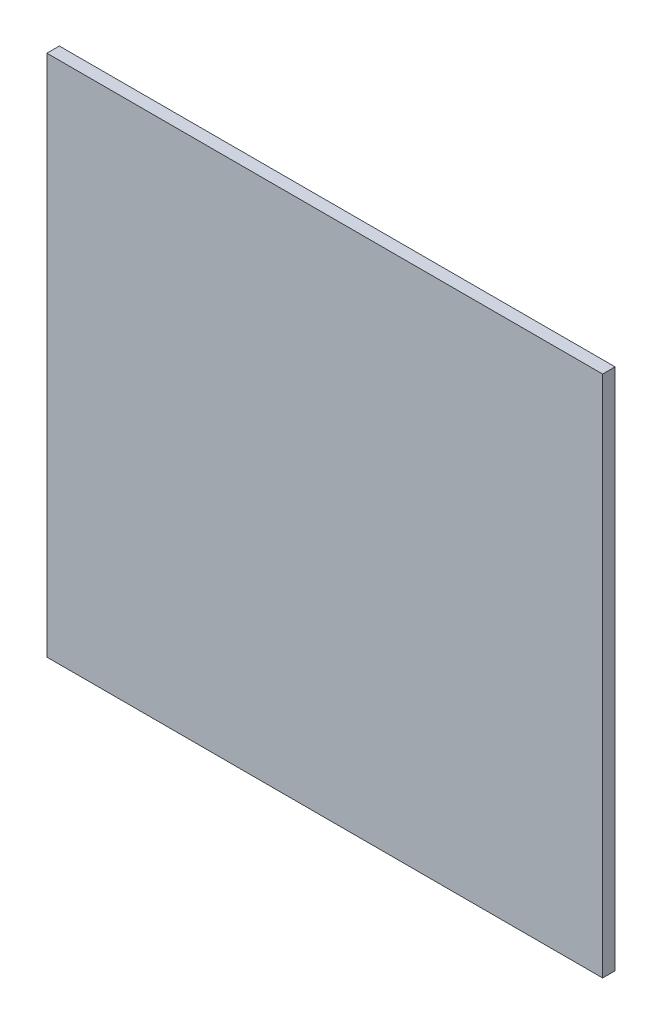
ISO-10303-21;
HEADER;
FILE_DESCRIPTION(('STEP AP214'),'2;1');
FILE_NAME('part.step','',(''),(''),'','','');
FILE_SCHEMA(('AUTOMOTIVE_DESIGN { 1 0 10303 214 1 1 1 1 }'));
ENDSEC;
DATA;
#1=APPLICATION_CONTEXT('core data for automotive mechanical design processes');
#2=APPLICATION_PROTOCOL_DEFINITION('international standard','automotive_design',2000,#1);
#3=PRODUCT_CONTEXT('',#1,'mechanical');
#4=PRODUCT('Part','Part','',(#3));
#5=PRODUCT_RELATED_PRODUCT_CATEGORY('part','',(#4));
#6=PRODUCT_DEFINITION_FORMATION('','',#4);
#7=PRODUCT_DEFINITION_CONTEXT('part definition',#1,'design');
#8=PRODUCT_DEFINITION('design','',#6,#7);
#9=PRODUCT_DEFINITION_SHAPE('','',#8);
#10=(LENGTH_UNIT() NAMED_UNIT(*) SI_UNIT(.MILLI.,.METRE.));
#11=(NAMED_UNIT(*) PLANE_ANGLE_UNIT() SI_UNIT($,.RADIAN.));
#12=(NAMED_UNIT(*) SI_UNIT($,.STERADIAN.) SOLID_ANGLE_UNIT());
#13=UNCERTAINTY_MEASURE_WITH_UNIT(LENGTH_MEASURE(1.E-05),#10,'distance_accuracy_value','');
#14=(GEOMETRIC_REPRESENTATION_CONTEXT(3) GLOBAL_UNCERTAINTY_ASSIGNED_CONTEXT((#13)) GLOBAL_UNIT_ASSIGNED_CONTEXT((#10,
#11,#12)) REPRESENTATION_CONTEXT('',''));
#15=CARTESIAN_POINT('',(0.,0.,0.));
#16=DIRECTION('',(0.,0.,1.));
#17=DIRECTION('',(1.,0.,0.));
#18=AXIS2_PLACEMENT_3D('',#15,#16,#17);
#19=CARTESIAN_POINT('',(-29.1556904840849,20.1508620689655,19.05));
#20=DIRECTION('',(1.,0.,0.));
#21=DIRECTION('',(0.,1.,0.));
#22=AXIS2_PLACEMENT_3D('',#19,#20,#21);
#23=PLANE('',#22);
#24=DIRECTION('',(0.,-1.,0.));
#25=VECTOR('',#24,1.);
#26=CARTESIAN_POINT('',(-29.1556904840849,20.1508620689655,0.));
#27=LINE('',#26,#25);
#28=CARTESIAN_POINT('',(-29.1556904840849,20.1508620689655,0.));
#29=VERTEX_POINT('',#28);
#30=CARTESIAN_POINT('',(-29.1556904840848,-779.849137931035,0.));
#31=VERTEX_POINT('',#30);
#32=EDGE_CURVE('E109',#29,#31,#27,.T.);
#33=ORIENTED_EDGE('',*,*,#32,.T.);
#34=DIRECTION('',(0.,0.,-1.));
#35=VECTOR('',#34,1.);
#36=CARTESIAN_POINT('',(-29.1556904840848,-779.849137931035,19.05));
#37=LINE('',#36,#35);
#38=CARTESIAN_POINT('',(-29.1556904840848,-779.849137931035,19.05));
#39=VERTEX_POINT('',#38);
#40=EDGE_CURVE('E11',#39,#31,#37,.T.);
#41=ORIENTED_EDGE('',*,*,#40,.F.);
#42=DIRECTION('',(0.,-1.,0.));
#43=VECTOR('',#42,1.);
#44=CARTESIAN_POINT('',(-29.1556904840849,20.1508620689655,19.05));
#45=LINE('',#44,#43);
#46=CARTESIAN_POINT('',(-29.1556904840849,20.1508620689655,19.05));
#47=VERTEX_POINT('',#46);
#48=EDGE_CURVE('E93',#47,#39,#45,.T.);
#49=ORIENTED_EDGE('',*,*,#48,.F.);
#50=DIRECTION('',(0.,0.,-1.));
#51=VECTOR('',#50,1.);
#52=CARTESIAN_POINT('',(-29.1556904840849,20.1508620689655,19.05));
#53=LINE('',#52,#51);
#54=EDGE_CURVE('E105',#47,#29,#53,.T.);
#55=ORIENTED_EDGE('',*,*,#54,.T.);
#56=EDGE_LOOP('',(#33,#41,#49,#55));
#57=FACE_BOUND('',#56,.T.);
#58=ADVANCED_FACE('F41',(#57),#23,.F.);
#59=CARTESIAN_POINT('',(-29.1556904840848,-779.849137931035,19.05));
#60=DIRECTION('',(0.,1.,0.));
#61=DIRECTION('',(0.,0.,1.));
#62=AXIS2_PLACEMENT_3D('',#59,#60,#61);
#63=PLANE('',#62);
#64=DIRECTION('',(1.,0.,0.));
#65=VECTOR('',#64,1.);
#66=CARTESIAN_POINT('',(-29.1556904840848,-779.849137931035,0.));
#67=LINE('',#66,#65);
#68=CARTESIAN_POINT('',(820.844309515915,-779.849137931035,0.));
#69=VERTEX_POINT('',#68);
#70=EDGE_CURVE('E98',#31,#69,#67,.T.);
#71=ORIENTED_EDGE('',*,*,#70,.T.);
#72=DIRECTION('',(0.,0.,-1.));
#73=VECTOR('',#72,1.);
#74=CARTESIAN_POINT('',(820.844309515915,-779.849137931035,19.05));
#75=LINE('',#74,#73);
#76=CARTESIAN_POINT('',(820.844309515915,-779.849137931035,19.05));
#77=VERTEX_POINT('',#76);
#78=EDGE_CURVE('E50',#77,#69,#75,.T.);
#79=ORIENTED_EDGE('',*,*,#78,.F.);
#80=DIRECTION('',(1.,0.,0.));
#81=VECTOR('',#80,1.);
#82=CARTESIAN_POINT('',(-29.1556904840848,-779.849137931035,19.05));
#83=LINE('',#82,#81);
#84=EDGE_CURVE('E88',#39,#77,#83,.T.);
#85=ORIENTED_EDGE('',*,*,#84,.F.);
#86=ORIENTED_EDGE('',*,*,#40,.T.);
#87=EDGE_LOOP('',(#71,#79,#85,#86));
#88=FACE_BOUND('',#87,.T.);
#89=ADVANCED_FACE('F97',(#88),#63,.F.);
#90=CARTESIAN_POINT('',(820.844309515915,20.1508620689655,19.05));
#91=DIRECTION('',(-1.,0.,0.));
#92=DIRECTION('',(0.,-1.,0.));
#93=AXIS2_PLACEMENT_3D('',#90,#91,#92);
#94=PLANE('',#93);
#95=DIRECTION('',(0.,1.,0.));
#96=VECTOR('',#95,1.);
#97=CARTESIAN_POINT('',(820.844309515915,20.1508620689655,0.));
#98=LINE('',#97,#96);
#99=CARTESIAN_POINT('',(820.844309515915,20.1508620689655,0.));
#100=VERTEX_POINT('',#99);
#101=EDGE_CURVE('E75',#69,#100,#98,.T.);
#102=ORIENTED_EDGE('',*,*,#101,.T.);
#103=DIRECTION('',(0.,0.,-1.));
#104=VECTOR('',#103,1.);
#105=CARTESIAN_POINT('',(820.844309515915,20.1508620689655,19.05));
#106=LINE('',#105,#104);
#107=CARTESIAN_POINT('',(820.844309515915,20.1508620689655,19.05));
#108=VERTEX_POINT('',#107);
#109=EDGE_CURVE('E100',#108,#100,#106,.T.);
#110=ORIENTED_EDGE('',*,*,#109,.F.);
#111=DIRECTION('',(0.,1.,0.));
#112=VECTOR('',#111,1.);
#113=CARTESIAN_POINT('',(820.844309515915,20.1508620689655,19.05));
#114=LINE('',#113,#112);
#115=EDGE_CURVE('E91',#77,#108,#114,.T.);
#116=ORIENTED_EDGE('',*,*,#115,.F.);
#117=ORIENTED_EDGE('',*,*,#78,.T.);
#118=EDGE_LOOP('',(#102,#110,#116,#117));
#119=FACE_BOUND('',#118,.T.);
#120=ADVANCED_FACE('F101',(#119),#94,.F.);
#121=CARTESIAN_POINT('',(-29.1556904840849,20.1508620689655,19.05));
#122=DIRECTION('',(0.,-1.,0.));
#123=DIRECTION('',(0.,0.,-1.));
#124=AXIS2_PLACEMENT_3D('',#121,#122,#123);
#125=PLANE('',#124);
#126=DIRECTION('',(-1.,0.,0.));
#127=VECTOR('',#126,1.);
#128=CARTESIAN_POINT('',(-29.1556904840849,20.1508620689655,0.));
#129=LINE('',#128,#127);
#130=EDGE_CURVE('E81',#100,#29,#129,.T.);
#131=ORIENTED_EDGE('',*,*,#130,.T.);
#132=ORIENTED_EDGE('',*,*,#54,.F.);
#133=DIRECTION('',(-1.,0.,0.));
#134=VECTOR('',#133,1.);
#135=CARTESIAN_POINT('',(-29.1556904840849,20.1508620689655,19.05));
#136=LINE('',#135,#134);
#137=EDGE_CURVE('E58',#108,#47,#136,.T.);
#138=ORIENTED_EDGE('',*,*,#137,.F.);
#139=ORIENTED_EDGE('',*,*,#109,.T.);
#140=EDGE_LOOP('',(#131,#132,#138,#139));
#141=FACE_BOUND('',#140,.T.);
#142=ADVANCED_FACE('F122',(#141),#125,.F.);
#143=CARTESIAN_POINT('',(0.,0.,19.05));
#144=DIRECTION('',(0.,0.,1.));
#145=DIRECTION('',(1.,0.,0.));
#146=AXIS2_PLACEMENT_3D('',#143,#144,#145);
#147=PLANE('',#146);
#148=ORIENTED_EDGE('',*,*,#48,.T.);
#149=ORIENTED_EDGE('',*,*,#84,.T.);
#150=ORIENTED_EDGE('',*,*,#115,.T.);
#151=ORIENTED_EDGE('',*,*,#137,.T.);
#152=EDGE_LOOP('',(#148,#149,#150,#151));
#153=FACE_BOUND('',#152,.T.);
#154=ADVANCED_FACE('F89',(#153),#147,.T.);
#155=CARTESIAN_POINT('',(0.,0.,0.));
#156=DIRECTION('',(0.,0.,1.));
#157=DIRECTION('',(1.,0.,0.));
#158=AXIS2_PLACEMENT_3D('',#155,#156,#157);
#159=PLANE('',#158);
#160=ORIENTED_EDGE('',*,*,#32,.F.);
#161=ORIENTED_EDGE('',*,*,#130,.F.);
#162=ORIENTED_EDGE('',*,*,#101,.F.);
#163=ORIENTED_EDGE('',*,*,#70,.F.);
#164=EDGE_LOOP('',(#160,#161,#162,#163));
#165=FACE_BOUND('',#164,.T.);
#166=ADVANCED_FACE('F125',(#165),#159,.F.);
#167=CLOSED_SHELL('',(#58,#89,#120,#142,#154,#166));
#168=MANIFOLD_SOLID_BREP('B2',#167);
#169=ADVANCED_BREP_SHAPE_REPRESENTATION('',(#18,#168),#14);
#170=SHAPE_DEFINITION_REPRESENTATION(#9,#169);
ENDSEC;
END-ISO-10303-21;
